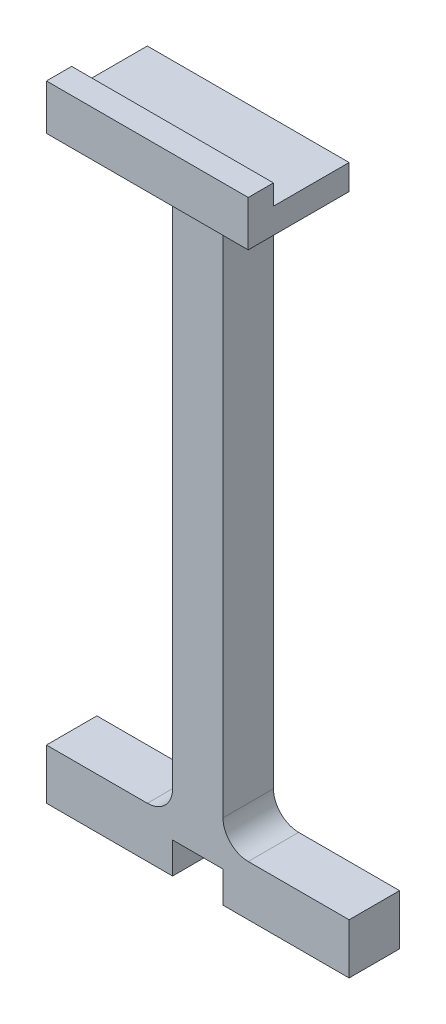
ISO-10303-21;
HEADER;
FILE_DESCRIPTION(('STEP AP214'),'2;1');
FILE_NAME('part.step','',(''),(''),'','','');
FILE_SCHEMA(('AUTOMOTIVE_DESIGN { 1 0 10303 214 1 1 1 1 }'));
ENDSEC;
DATA;
#1=APPLICATION_CONTEXT('core data for automotive mechanical design processes');
#2=APPLICATION_PROTOCOL_DEFINITION('international standard','automotive_design',2000,#1);
#3=PRODUCT_CONTEXT('',#1,'mechanical');
#4=PRODUCT('Part','Part','',(#3));
#5=PRODUCT_RELATED_PRODUCT_CATEGORY('part','',(#4));
#6=PRODUCT_DEFINITION_FORMATION('','',#4);
#7=PRODUCT_DEFINITION_CONTEXT('part definition',#1,'design');
#8=PRODUCT_DEFINITION('design','',#6,#7);
#9=PRODUCT_DEFINITION_SHAPE('','',#8);
#10=(LENGTH_UNIT() NAMED_UNIT(*) SI_UNIT(.MILLI.,.METRE.));
#11=(NAMED_UNIT(*) PLANE_ANGLE_UNIT() SI_UNIT($,.RADIAN.));
#12=(NAMED_UNIT(*) SI_UNIT($,.STERADIAN.) SOLID_ANGLE_UNIT());
#13=UNCERTAINTY_MEASURE_WITH_UNIT(LENGTH_MEASURE(1.E-05),#10,'distance_accuracy_value','');
#14=(GEOMETRIC_REPRESENTATION_CONTEXT(3) GLOBAL_UNCERTAINTY_ASSIGNED_CONTEXT((#13)) GLOBAL_UNIT_ASSIGNED_CONTEXT((#10,
#11,#12)) REPRESENTATION_CONTEXT('',''));
#15=CARTESIAN_POINT('',(0.,0.,0.));
#16=DIRECTION('',(0.,0.,1.));
#17=DIRECTION('',(1.,0.,0.));
#18=AXIS2_PLACEMENT_3D('',#15,#16,#17);
#19=CARTESIAN_POINT('',(-30.,-67.5,5.));
#20=DIRECTION('',(0.,1.,0.));
#21=DIRECTION('',(0.,0.,1.));
#22=AXIS2_PLACEMENT_3D('',#19,#20,#21);
#23=PLANE('',#22);
#24=DIRECTION('',(1.,0.,0.));
#25=VECTOR('',#24,1.);
#26=CARTESIAN_POINT('',(-30.,-67.5,5.));
#27=LINE('',#26,#25);
#28=CARTESIAN_POINT('',(5.00000000000002,-67.5,5.));
#29=VERTEX_POINT('',#28);
#30=CARTESIAN_POINT('',(30.,-67.5,5.));
#31=VERTEX_POINT('',#30);
#32=EDGE_CURVE('E262',#29,#31,#27,.T.);
#33=ORIENTED_EDGE('',*,*,#32,.F.);
#34=DIRECTION('',(0.,0.,1.));
#35=VECTOR('',#34,1.);
#36=CARTESIAN_POINT('',(5.00000000000002,-67.5,-5.));
#37=LINE('',#36,#35);
#38=CARTESIAN_POINT('',(5.00000000000002,-67.5,-5.));
#39=VERTEX_POINT('',#38);
#40=EDGE_CURVE('E218',#39,#29,#37,.T.);
#41=ORIENTED_EDGE('',*,*,#40,.F.);
#42=DIRECTION('',(1.,0.,0.));
#43=VECTOR('',#42,1.);
#44=CARTESIAN_POINT('',(-30.,-67.5,-5.));
#45=LINE('',#44,#43);
#46=CARTESIAN_POINT('',(30.,-67.5,-5.));
#47=VERTEX_POINT('',#46);
#48=EDGE_CURVE('E205',#39,#47,#45,.T.);
#49=ORIENTED_EDGE('',*,*,#48,.T.);
#50=DIRECTION('',(0.,0.,-1.));
#51=VECTOR('',#50,1.);
#52=CARTESIAN_POINT('',(30.,-67.5,5.));
#53=LINE('',#52,#51);
#54=EDGE_CURVE('E302',#31,#47,#53,.T.);
#55=ORIENTED_EDGE('',*,*,#54,.F.);
#56=EDGE_LOOP('',(#33,#41,#49,#55));
#57=FACE_BOUND('',#56,.T.);
#58=ADVANCED_FACE('F33',(#57),#23,.F.);
#59=CARTESIAN_POINT('',(-20.,62.5,5.));
#60=DIRECTION('',(0.,-1.,0.));
#61=DIRECTION('',(0.,0.,-1.));
#62=AXIS2_PLACEMENT_3D('',#59,#60,#61);
#63=PLANE('',#62);
#64=DIRECTION('',(-1.,0.,0.));
#65=VECTOR('',#64,1.);
#66=CARTESIAN_POINT('',(-20.,62.5,10.));
#67=LINE('',#66,#65);
#68=CARTESIAN_POINT('',(20.,62.5,10.));
#69=VERTEX_POINT('',#68);
#70=CARTESIAN_POINT('',(-20.,62.5,10.));
#71=VERTEX_POINT('',#70);
#72=EDGE_CURVE('E220',#69,#71,#67,.T.);
#73=ORIENTED_EDGE('',*,*,#72,.F.);
#74=DIRECTION('',(0.,0.,-1.));
#75=VECTOR('',#74,1.);
#76=CARTESIAN_POINT('',(20.,62.5,5.));
#77=LINE('',#76,#75);
#78=CARTESIAN_POINT('',(20.,62.5,-5.));
#79=VERTEX_POINT('',#78);
#80=EDGE_CURVE('E316',#69,#79,#77,.T.);
#81=ORIENTED_EDGE('',*,*,#80,.T.);
#82=DIRECTION('',(-1.,0.,0.));
#83=VECTOR('',#82,1.);
#84=CARTESIAN_POINT('',(-20.,62.5,-5.));
#85=LINE('',#84,#83);
#86=CARTESIAN_POINT('',(-20.,62.5,-5.));
#87=VERTEX_POINT('',#86);
#88=EDGE_CURVE('E279',#79,#87,#85,.T.);
#89=ORIENTED_EDGE('',*,*,#88,.T.);
#90=DIRECTION('',(0.,0.,-1.));
#91=VECTOR('',#90,1.);
#92=CARTESIAN_POINT('',(-20.,62.5,5.));
#93=LINE('',#92,#91);
#94=EDGE_CURVE('E314',#71,#87,#93,.T.);
#95=ORIENTED_EDGE('',*,*,#94,.F.);
#96=EDGE_LOOP('',(#73,#81,#89,#95));
#97=FACE_BOUND('',#96,.T.);
#98=ADVANCED_FACE('F381',(#97),#63,.F.);
#99=CARTESIAN_POINT('',(0.,0.,5.));
#100=DIRECTION('',(0.,0.,1.));
#101=DIRECTION('',(1.,0.,0.));
#102=AXIS2_PLACEMENT_3D('',#99,#100,#101);
#103=PLANE('',#102);
#104=DIRECTION('',(0.,1.,0.));
#105=VECTOR('',#104,1.);
#106=CARTESIAN_POINT('',(5.00000000000002,57.5,5.));
#107=LINE('',#106,#105);
#108=CARTESIAN_POINT('',(5.00000000000002,-52.5,5.));
#109=VERTEX_POINT('',#108);
#110=CARTESIAN_POINT('',(5.00000000000002,52.5,5.));
#111=VERTEX_POINT('',#110);
#112=EDGE_CURVE('E251',#109,#111,#107,.T.);
#113=ORIENTED_EDGE('',*,*,#112,.T.);
#114=DIRECTION('',(-1.,0.,0.));
#115=VECTOR('',#114,1.);
#116=CARTESIAN_POINT('',(0.,52.5,5.));
#117=LINE('',#116,#115);
#118=CARTESIAN_POINT('',(-5.00000000000002,52.5,5.));
#119=VERTEX_POINT('',#118);
#120=EDGE_CURVE('E340',#111,#119,#117,.T.);
#121=ORIENTED_EDGE('',*,*,#120,.T.);
#122=DIRECTION('',(0.,-1.,0.));
#123=VECTOR('',#122,1.);
#124=CARTESIAN_POINT('',(-5.00000000000002,57.5,5.));
#125=LINE('',#124,#123);
#126=CARTESIAN_POINT('',(-5.00000000000002,-52.5,5.));
#127=VERTEX_POINT('',#126);
#128=EDGE_CURVE('E254',#119,#127,#125,.T.);
#129=ORIENTED_EDGE('',*,*,#128,.T.);
#130=CARTESIAN_POINT('',(-10.,-52.5,5.));
#131=DIRECTION('',(0.,0.,1.));
#132=DIRECTION('',(1.,0.,0.));
#133=AXIS2_PLACEMENT_3D('',#130,#131,#132);
#134=CIRCLE('',#133,5.);
#135=CARTESIAN_POINT('',(-10.,-57.5,5.));
#136=VERTEX_POINT('',#135);
#137=EDGE_CURVE('E348',#127,#136,#134,.F.);
#138=ORIENTED_EDGE('',*,*,#137,.T.);
#139=DIRECTION('',(-1.,0.,0.));
#140=VECTOR('',#139,1.);
#141=CARTESIAN_POINT('',(-30.,-57.5,5.));
#142=LINE('',#141,#140);
#143=CARTESIAN_POINT('',(-30.,-57.5,5.));
#144=VERTEX_POINT('',#143);
#145=EDGE_CURVE('E258',#136,#144,#142,.T.);
#146=ORIENTED_EDGE('',*,*,#145,.T.);
#147=DIRECTION('',(0.,-1.,0.));
#148=VECTOR('',#147,1.);
#149=CARTESIAN_POINT('',(-30.,-67.5,5.));
#150=LINE('',#149,#148);
#151=CARTESIAN_POINT('',(-30.,-67.5,5.));
#152=VERTEX_POINT('',#151);
#153=EDGE_CURVE('E260',#144,#152,#150,.T.);
#154=ORIENTED_EDGE('',*,*,#153,.T.);
#155=CARTESIAN_POINT('',(-5.00000000000002,-67.5,5.));
#156=VERTEX_POINT('',#155);
#157=EDGE_CURVE('E263',#152,#156,#27,.T.);
#158=ORIENTED_EDGE('',*,*,#157,.T.);
#159=DIRECTION('',(0.,-1.,0.));
#160=VECTOR('',#159,1.);
#161=CARTESIAN_POINT('',(-5.00000000000002,-67.5,5.));
#162=LINE('',#161,#160);
#163=CARTESIAN_POINT('',(-5.00000000000002,-61.3,5.));
#164=VERTEX_POINT('',#163);
#165=EDGE_CURVE('E206',#164,#156,#162,.T.);
#166=ORIENTED_EDGE('',*,*,#165,.F.);
#167=DIRECTION('',(-1.,0.,0.));
#168=VECTOR('',#167,1.);
#169=CARTESIAN_POINT('',(5.00000000000002,-61.3,5.));
#170=LINE('',#169,#168);
#171=CARTESIAN_POINT('',(5.00000000000002,-61.3,5.));
#172=VERTEX_POINT('',#171);
#173=EDGE_CURVE('E208',#172,#164,#170,.T.);
#174=ORIENTED_EDGE('',*,*,#173,.F.);
#175=DIRECTION('',(0.,1.,0.));
#176=VECTOR('',#175,1.);
#177=CARTESIAN_POINT('',(5.00000000000002,-67.5,5.));
#178=LINE('',#177,#176);
#179=EDGE_CURVE('E188',#29,#172,#178,.T.);
#180=ORIENTED_EDGE('',*,*,#179,.F.);
#181=ORIENTED_EDGE('',*,*,#32,.T.);
#182=DIRECTION('',(0.,1.,0.));
#183=VECTOR('',#182,1.);
#184=CARTESIAN_POINT('',(30.,-67.5,5.));
#185=LINE('',#184,#183);
#186=CARTESIAN_POINT('',(30.,-57.5,5.));
#187=VERTEX_POINT('',#186);
#188=EDGE_CURVE('E266',#31,#187,#185,.T.);
#189=ORIENTED_EDGE('',*,*,#188,.T.);
#190=DIRECTION('',(-1.,0.,0.));
#191=VECTOR('',#190,1.);
#192=CARTESIAN_POINT('',(5.00000000000002,-57.5,5.));
#193=LINE('',#192,#191);
#194=CARTESIAN_POINT('',(10.,-57.5,5.));
#195=VERTEX_POINT('',#194);
#196=EDGE_CURVE('E268',#187,#195,#193,.T.);
#197=ORIENTED_EDGE('',*,*,#196,.T.);
#198=CARTESIAN_POINT('',(10.,-52.5,5.));
#199=DIRECTION('',(0.,0.,1.));
#200=DIRECTION('',(1.,0.,0.));
#201=AXIS2_PLACEMENT_3D('',#198,#199,#200);
#202=CIRCLE('',#201,5.);
#203=EDGE_CURVE('E344',#195,#109,#202,.F.);
#204=ORIENTED_EDGE('',*,*,#203,.T.);
#205=EDGE_LOOP('',(#113,#121,#129,#138,#146,#154,#158,#166,#174,#180,#181,#189,#197,#204));
#206=FACE_BOUND('',#205,.T.);
#207=ADVANCED_FACE('F388',(#206),#103,.T.);
#208=CARTESIAN_POINT('',(5.00000000000002,57.5,5.));
#209=DIRECTION('',(-1.,0.,0.));
#210=DIRECTION('',(0.,0.,1.));
#211=AXIS2_PLACEMENT_3D('',#208,#209,#210);
#212=PLANE('',#211);
#213=ORIENTED_EDGE('',*,*,#112,.F.);
#214=DIRECTION('',(0.,0.,-1.));
#215=VECTOR('',#214,1.);
#216=CARTESIAN_POINT('',(5.00000000000002,-52.5,-5.));
#217=LINE('',#216,#215);
#218=CARTESIAN_POINT('',(5.00000000000002,-52.5,-5.));
#219=VERTEX_POINT('',#218);
#220=EDGE_CURVE('E323',#109,#219,#217,.T.);
#221=ORIENTED_EDGE('',*,*,#220,.T.);
#222=DIRECTION('',(0.,1.,0.));
#223=VECTOR('',#222,1.);
#224=CARTESIAN_POINT('',(5.00000000000002,57.5,-5.));
#225=LINE('',#224,#223);
#226=CARTESIAN_POINT('',(5.00000000000002,52.5,-5.));
#227=VERTEX_POINT('',#226);
#228=EDGE_CURVE('E249',#219,#227,#225,.T.);
#229=ORIENTED_EDGE('',*,*,#228,.T.);
#230=DIRECTION('',(0.,0.,-1.));
#231=VECTOR('',#230,1.);
#232=CARTESIAN_POINT('',(5.00000000000002,52.5,5.));
#233=LINE('',#232,#231);
#234=EDGE_CURVE('E321',#227,#111,#233,.F.);
#235=ORIENTED_EDGE('',*,*,#234,.T.);
#236=EDGE_LOOP('',(#213,#221,#229,#235));
#237=FACE_BOUND('',#236,.T.);
#238=ADVANCED_FACE('F461',(#237),#212,.F.);
#239=CARTESIAN_POINT('',(20.,57.5,5.));
#240=DIRECTION('',(-1.,0.,0.));
#241=DIRECTION('',(0.,0.,1.));
#242=AXIS2_PLACEMENT_3D('',#239,#240,#241);
#243=PLANE('',#242);
#244=DIRECTION('',(0.,1.,0.));
#245=VECTOR('',#244,1.);
#246=CARTESIAN_POINT('',(20.,57.5,-5.));
#247=LINE('',#246,#245);
#248=CARTESIAN_POINT('',(20.,57.5,-5.));
#249=VERTEX_POINT('',#248);
#250=EDGE_CURVE('E276',#249,#79,#247,.T.);
#251=ORIENTED_EDGE('',*,*,#250,.T.);
#252=ORIENTED_EDGE('',*,*,#80,.F.);
#253=DIRECTION('',(0.,-1.,0.));
#254=VECTOR('',#253,1.);
#255=CARTESIAN_POINT('',(20.,66.5,10.));
#256=LINE('',#255,#254);
#257=CARTESIAN_POINT('',(20.,66.5,10.));
#258=VERTEX_POINT('',#257);
#259=EDGE_CURVE('E240',#258,#69,#256,.T.);
#260=ORIENTED_EDGE('',*,*,#259,.F.);
#261=DIRECTION('',(0.,0.,-1.));
#262=VECTOR('',#261,1.);
#263=CARTESIAN_POINT('',(20.,66.5,15.));
#264=LINE('',#263,#262);
#265=CARTESIAN_POINT('',(20.,66.5,15.));
#266=VERTEX_POINT('',#265);
#267=EDGE_CURVE('E231',#266,#258,#264,.T.);
#268=ORIENTED_EDGE('',*,*,#267,.F.);
#269=DIRECTION('',(0.,1.,0.));
#270=VECTOR('',#269,1.);
#271=CARTESIAN_POINT('',(20.,57.5,15.));
#272=LINE('',#271,#270);
#273=CARTESIAN_POINT('',(20.,57.5,15.));
#274=VERTEX_POINT('',#273);
#275=EDGE_CURVE('E247',#274,#266,#272,.T.);
#276=ORIENTED_EDGE('',*,*,#275,.F.);
#277=DIRECTION('',(0.,0.,-1.));
#278=VECTOR('',#277,1.);
#279=CARTESIAN_POINT('',(20.,57.5,5.));
#280=LINE('',#279,#278);
#281=EDGE_CURVE('E318',#274,#249,#280,.T.);
#282=ORIENTED_EDGE('',*,*,#281,.T.);
#283=EDGE_LOOP('',(#251,#252,#260,#268,#276,#282));
#284=FACE_BOUND('',#283,.T.);
#285=ADVANCED_FACE('F451',(#284),#243,.F.);
#286=CARTESIAN_POINT('',(-20.,57.5,5.));
#287=DIRECTION('',(1.,0.,0.));
#288=DIRECTION('',(0.,1.,0.));
#289=AXIS2_PLACEMENT_3D('',#286,#287,#288);
#290=PLANE('',#289);
#291=DIRECTION('',(0.,-1.,0.));
#292=VECTOR('',#291,1.);
#293=CARTESIAN_POINT('',(-20.,57.5,-5.));
#294=LINE('',#293,#292);
#295=CARTESIAN_POINT('',(-20.,57.5,-5.));
#296=VERTEX_POINT('',#295);
#297=EDGE_CURVE('E282',#87,#296,#294,.T.);
#298=ORIENTED_EDGE('',*,*,#297,.T.);
#299=DIRECTION('',(0.,0.,-1.));
#300=VECTOR('',#299,1.);
#301=CARTESIAN_POINT('',(-20.,57.5,5.));
#302=LINE('',#301,#300);
#303=CARTESIAN_POINT('',(-20.,57.5,15.));
#304=VERTEX_POINT('',#303);
#305=EDGE_CURVE('E311',#304,#296,#302,.T.);
#306=ORIENTED_EDGE('',*,*,#305,.F.);
#307=DIRECTION('',(0.,1.,0.));
#308=VECTOR('',#307,1.);
#309=CARTESIAN_POINT('',(-20.,57.5,15.));
#310=LINE('',#309,#308);
#311=CARTESIAN_POINT('',(-20.,66.5,15.));
#312=VERTEX_POINT('',#311);
#313=EDGE_CURVE('E246',#304,#312,#310,.T.);
#314=ORIENTED_EDGE('',*,*,#313,.T.);
#315=DIRECTION('',(0.,0.,1.));
#316=VECTOR('',#315,1.);
#317=CARTESIAN_POINT('',(-20.,66.5,15.));
#318=LINE('',#317,#316);
#319=CARTESIAN_POINT('',(-20.,66.5,10.));
#320=VERTEX_POINT('',#319);
#321=EDGE_CURVE('E225',#320,#312,#318,.T.);
#322=ORIENTED_EDGE('',*,*,#321,.F.);
#323=DIRECTION('',(0.,-1.,0.));
#324=VECTOR('',#323,1.);
#325=CARTESIAN_POINT('',(-20.,66.5,10.));
#326=LINE('',#325,#324);
#327=EDGE_CURVE('E235',#320,#71,#326,.T.);
#328=ORIENTED_EDGE('',*,*,#327,.T.);
#329=ORIENTED_EDGE('',*,*,#94,.T.);
#330=EDGE_LOOP('',(#298,#306,#314,#322,#328,#329));
#331=FACE_BOUND('',#330,.T.);
#332=ADVANCED_FACE('F435',(#331),#290,.F.);
#333=CARTESIAN_POINT('',(-20.,57.5,5.));
#334=DIRECTION('',(0.,1.,0.));
#335=DIRECTION('',(0.,0.,1.));
#336=AXIS2_PLACEMENT_3D('',#333,#334,#335);
#337=PLANE('',#336);
#338=DIRECTION('',(1.,0.,0.));
#339=VECTOR('',#338,1.);
#340=CARTESIAN_POINT('',(-20.,57.5,-5.));
#341=LINE('',#340,#339);
#342=CARTESIAN_POINT('',(-10.,57.5,-5.));
#343=VERTEX_POINT('',#342);
#344=EDGE_CURVE('E284',#296,#343,#341,.T.);
#345=ORIENTED_EDGE('',*,*,#344,.T.);
#346=DIRECTION('',(0.,0.,-1.));
#347=VECTOR('',#346,1.);
#348=CARTESIAN_POINT('',(-10.,57.5,5.));
#349=LINE('',#348,#347);
#350=CARTESIAN_POINT('',(-10.,57.5,10.));
#351=VERTEX_POINT('',#350);
#352=EDGE_CURVE('E50',#343,#351,#349,.F.);
#353=ORIENTED_EDGE('',*,*,#352,.T.);
#354=DIRECTION('',(-1.,0.,0.));
#355=VECTOR('',#354,1.);
#356=CARTESIAN_POINT('',(-20.,57.5,10.));
#357=LINE('',#356,#355);
#358=CARTESIAN_POINT('',(10.,57.5,10.));
#359=VERTEX_POINT('',#358);
#360=EDGE_CURVE('E54',#351,#359,#357,.F.);
#361=ORIENTED_EDGE('',*,*,#360,.T.);
#362=DIRECTION('',(0.,0.,-1.));
#363=VECTOR('',#362,1.);
#364=CARTESIAN_POINT('',(10.,57.5,-5.));
#365=LINE('',#364,#363);
#366=CARTESIAN_POINT('',(10.,57.5,-5.));
#367=VERTEX_POINT('',#366);
#368=EDGE_CURVE('E336',#359,#367,#365,.T.);
#369=ORIENTED_EDGE('',*,*,#368,.T.);
#370=DIRECTION('',(1.,0.,0.));
#371=VECTOR('',#370,1.);
#372=CARTESIAN_POINT('',(5.00000000000002,57.5,-5.));
#373=LINE('',#372,#371);
#374=EDGE_CURVE('E274',#367,#249,#373,.T.);
#375=ORIENTED_EDGE('',*,*,#374,.T.);
#376=ORIENTED_EDGE('',*,*,#281,.F.);
#377=DIRECTION('',(1.,0.,0.));
#378=VECTOR('',#377,1.);
#379=CARTESIAN_POINT('',(-20.,57.5,15.));
#380=LINE('',#379,#378);
#381=EDGE_CURVE('E243',#304,#274,#380,.T.);
#382=ORIENTED_EDGE('',*,*,#381,.F.);
#383=ORIENTED_EDGE('',*,*,#305,.T.);
#384=EDGE_LOOP('',(#345,#353,#361,#369,#375,#376,#382,#383));
#385=FACE_BOUND('',#384,.T.);
#386=ADVANCED_FACE('F431',(#385),#337,.F.);
#387=CARTESIAN_POINT('',(-5.00000000000002,57.5,5.));
#388=DIRECTION('',(1.,0.,0.));
#389=DIRECTION('',(0.,0.,-1.));
#390=AXIS2_PLACEMENT_3D('',#387,#388,#389);
#391=PLANE('',#390);
#392=DIRECTION('',(0.,-1.,0.));
#393=VECTOR('',#392,1.);
#394=CARTESIAN_POINT('',(-5.00000000000002,57.5,-5.));
#395=LINE('',#394,#393);
#396=CARTESIAN_POINT('',(-5.00000000000002,52.5,-5.));
#397=VERTEX_POINT('',#396);
#398=CARTESIAN_POINT('',(-5.00000000000002,-52.5,-5.));
#399=VERTEX_POINT('',#398);
#400=EDGE_CURVE('E286',#397,#399,#395,.T.);
#401=ORIENTED_EDGE('',*,*,#400,.T.);
#402=DIRECTION('',(0.,0.,-1.));
#403=VECTOR('',#402,1.);
#404=CARTESIAN_POINT('',(-5.00000000000002,-52.5,5.));
#405=LINE('',#404,#403);
#406=EDGE_CURVE('E334',#399,#127,#405,.F.);
#407=ORIENTED_EDGE('',*,*,#406,.T.);
#408=ORIENTED_EDGE('',*,*,#128,.F.);
#409=DIRECTION('',(0.,0.,-1.));
#410=VECTOR('',#409,1.);
#411=CARTESIAN_POINT('',(-5.00000000000002,52.5,-5.));
#412=LINE('',#411,#410);
#413=EDGE_CURVE('E331',#119,#397,#412,.T.);
#414=ORIENTED_EDGE('',*,*,#413,.T.);
#415=EDGE_LOOP('',(#401,#407,#408,#414));
#416=FACE_BOUND('',#415,.T.);
#417=ADVANCED_FACE('F423',(#416),#391,.F.);
#418=CARTESIAN_POINT('',(-30.,-57.5,5.));
#419=DIRECTION('',(0.,-1.,0.));
#420=DIRECTION('',(0.,0.,-1.));
#421=AXIS2_PLACEMENT_3D('',#418,#419,#420);
#422=PLANE('',#421);
#423=ORIENTED_EDGE('',*,*,#145,.F.);
#424=DIRECTION('',(0.,0.,-1.));
#425=VECTOR('',#424,1.);
#426=CARTESIAN_POINT('',(-10.,-57.5,-5.));
#427=LINE('',#426,#425);
#428=CARTESIAN_POINT('',(-10.,-57.5,-5.));
#429=VERTEX_POINT('',#428);
#430=EDGE_CURVE('E328',#136,#429,#427,.T.);
#431=ORIENTED_EDGE('',*,*,#430,.T.);
#432=DIRECTION('',(-1.,0.,0.));
#433=VECTOR('',#432,1.);
#434=CARTESIAN_POINT('',(-30.,-57.5,-5.));
#435=LINE('',#434,#433);
#436=CARTESIAN_POINT('',(-30.,-57.5,-5.));
#437=VERTEX_POINT('',#436);
#438=EDGE_CURVE('E289',#429,#437,#435,.T.);
#439=ORIENTED_EDGE('',*,*,#438,.T.);
#440=DIRECTION('',(0.,0.,-1.));
#441=VECTOR('',#440,1.);
#442=CARTESIAN_POINT('',(-30.,-57.5,5.));
#443=LINE('',#442,#441);
#444=EDGE_CURVE('E308',#144,#437,#443,.T.);
#445=ORIENTED_EDGE('',*,*,#444,.F.);
#446=EDGE_LOOP('',(#423,#431,#439,#445));
#447=FACE_BOUND('',#446,.T.);
#448=ADVANCED_FACE('F404',(#447),#422,.F.);
#449=CARTESIAN_POINT('',(-30.,-67.5,5.));
#450=DIRECTION('',(1.,0.,0.));
#451=DIRECTION('',(0.,0.,-1.));
#452=AXIS2_PLACEMENT_3D('',#449,#450,#451);
#453=PLANE('',#452);
#454=DIRECTION('',(0.,-1.,0.));
#455=VECTOR('',#454,1.);
#456=CARTESIAN_POINT('',(-30.,-67.5,-5.));
#457=LINE('',#456,#455);
#458=CARTESIAN_POINT('',(-30.,-67.5,-5.));
#459=VERTEX_POINT('',#458);
#460=EDGE_CURVE('E291',#437,#459,#457,.T.);
#461=ORIENTED_EDGE('',*,*,#460,.T.);
#462=DIRECTION('',(0.,0.,-1.));
#463=VECTOR('',#462,1.);
#464=CARTESIAN_POINT('',(-30.,-67.5,5.));
#465=LINE('',#464,#463);
#466=EDGE_CURVE('E305',#152,#459,#465,.T.);
#467=ORIENTED_EDGE('',*,*,#466,.F.);
#468=ORIENTED_EDGE('',*,*,#153,.F.);
#469=ORIENTED_EDGE('',*,*,#444,.T.);
#470=EDGE_LOOP('',(#461,#467,#468,#469));
#471=FACE_BOUND('',#470,.T.);
#472=ADVANCED_FACE('F396',(#471),#453,.F.);
#473=CARTESIAN_POINT('',(-5.00000000000002,-67.5,-5.));
#474=VERTEX_POINT('',#473);
#475=EDGE_CURVE('E293',#459,#474,#45,.T.);
#476=ORIENTED_EDGE('',*,*,#475,.T.);
#477=DIRECTION('',(0.,0.,1.));
#478=VECTOR('',#477,1.);
#479=CARTESIAN_POINT('',(-5.00000000000002,-67.5,-5.));
#480=LINE('',#479,#478);
#481=EDGE_CURVE('E221',#474,#156,#480,.T.);
#482=ORIENTED_EDGE('',*,*,#481,.T.);
#483=ORIENTED_EDGE('',*,*,#157,.F.);
#484=ORIENTED_EDGE('',*,*,#466,.T.);
#485=EDGE_LOOP('',(#476,#482,#483,#484));
#486=FACE_BOUND('',#485,.T.);
#487=ADVANCED_FACE('F384',(#486),#23,.F.);
#488=CARTESIAN_POINT('',(30.,-67.5,5.));
#489=DIRECTION('',(-1.,0.,0.));
#490=DIRECTION('',(0.,0.,1.));
#491=AXIS2_PLACEMENT_3D('',#488,#489,#490);
#492=PLANE('',#491);
#493=DIRECTION('',(0.,1.,0.));
#494=VECTOR('',#493,1.);
#495=CARTESIAN_POINT('',(30.,-67.5,-5.));
#496=LINE('',#495,#494);
#497=CARTESIAN_POINT('',(30.,-57.5,-5.));
#498=VERTEX_POINT('',#497);
#499=EDGE_CURVE('E296',#47,#498,#496,.T.);
#500=ORIENTED_EDGE('',*,*,#499,.T.);
#501=DIRECTION('',(0.,0.,-1.));
#502=VECTOR('',#501,1.);
#503=CARTESIAN_POINT('',(30.,-57.5,5.));
#504=LINE('',#503,#502);
#505=EDGE_CURVE('E271',#187,#498,#504,.T.);
#506=ORIENTED_EDGE('',*,*,#505,.F.);
#507=ORIENTED_EDGE('',*,*,#188,.F.);
#508=ORIENTED_EDGE('',*,*,#54,.T.);
#509=EDGE_LOOP('',(#500,#506,#507,#508));
#510=FACE_BOUND('',#509,.T.);
#511=ADVANCED_FACE('F395',(#510),#492,.F.);
#512=CARTESIAN_POINT('',(5.00000000000002,-57.5,5.));
#513=DIRECTION('',(0.,-1.,0.));
#514=DIRECTION('',(0.,0.,-1.));
#515=AXIS2_PLACEMENT_3D('',#512,#513,#514);
#516=PLANE('',#515);
#517=DIRECTION('',(-1.,0.,0.));
#518=VECTOR('',#517,1.);
#519=CARTESIAN_POINT('',(5.00000000000002,-57.5,-5.));
#520=LINE('',#519,#518);
#521=CARTESIAN_POINT('',(10.,-57.5,-5.));
#522=VERTEX_POINT('',#521);
#523=EDGE_CURVE('E255',#498,#522,#520,.T.);
#524=ORIENTED_EDGE('',*,*,#523,.T.);
#525=DIRECTION('',(0.,0.,-1.));
#526=VECTOR('',#525,1.);
#527=CARTESIAN_POINT('',(10.,-57.5,5.));
#528=LINE('',#527,#526);
#529=EDGE_CURVE('E326',#522,#195,#528,.F.);
#530=ORIENTED_EDGE('',*,*,#529,.T.);
#531=ORIENTED_EDGE('',*,*,#196,.F.);
#532=ORIENTED_EDGE('',*,*,#505,.T.);
#533=EDGE_LOOP('',(#524,#530,#531,#532));
#534=FACE_BOUND('',#533,.T.);
#535=ADVANCED_FACE('F402',(#534),#516,.F.);
#536=CARTESIAN_POINT('',(0.,0.,-5.));
#537=DIRECTION('',(0.,0.,1.));
#538=DIRECTION('',(1.,0.,0.));
#539=AXIS2_PLACEMENT_3D('',#536,#537,#538);
#540=PLANE('',#539);
#541=ORIENTED_EDGE('',*,*,#48,.F.);
#542=DIRECTION('',(0.,1.,0.));
#543=VECTOR('',#542,1.);
#544=CARTESIAN_POINT('',(5.00000000000002,-67.5,-5.));
#545=LINE('',#544,#543);
#546=CARTESIAN_POINT('',(5.00000000000002,-61.3,-5.));
#547=VERTEX_POINT('',#546);
#548=EDGE_CURVE('E185',#39,#547,#545,.T.);
#549=ORIENTED_EDGE('',*,*,#548,.T.);
#550=DIRECTION('',(-1.,0.,0.));
#551=VECTOR('',#550,1.);
#552=CARTESIAN_POINT('',(5.00000000000002,-61.3,-5.));
#553=LINE('',#552,#551);
#554=CARTESIAN_POINT('',(-5.00000000000002,-61.3,-5.));
#555=VERTEX_POINT('',#554);
#556=EDGE_CURVE('E197',#547,#555,#553,.T.);
#557=ORIENTED_EDGE('',*,*,#556,.T.);
#558=DIRECTION('',(0.,-1.,0.));
#559=VECTOR('',#558,1.);
#560=CARTESIAN_POINT('',(-5.00000000000002,-67.5,-5.));
#561=LINE('',#560,#559);
#562=EDGE_CURVE('E193',#555,#474,#561,.T.);
#563=ORIENTED_EDGE('',*,*,#562,.T.);
#564=ORIENTED_EDGE('',*,*,#475,.F.);
#565=ORIENTED_EDGE('',*,*,#460,.F.);
#566=ORIENTED_EDGE('',*,*,#438,.F.);
#567=CARTESIAN_POINT('',(-10.,-52.5,-5.));
#568=DIRECTION('',(0.,0.,1.));
#569=DIRECTION('',(1.,0.,0.));
#570=AXIS2_PLACEMENT_3D('',#567,#568,#569);
#571=CIRCLE('',#570,5.);
#572=EDGE_CURVE('E346',#429,#399,#571,.T.);
#573=ORIENTED_EDGE('',*,*,#572,.T.);
#574=ORIENTED_EDGE('',*,*,#400,.F.);
#575=CARTESIAN_POINT('',(-10.,52.5,-5.));
#576=DIRECTION('',(0.,0.,1.));
#577=DIRECTION('',(1.,0.,0.));
#578=AXIS2_PLACEMENT_3D('',#575,#576,#577);
#579=CIRCLE('',#578,5.);
#580=EDGE_CURVE('E42',#397,#343,#579,.T.);
#581=ORIENTED_EDGE('',*,*,#580,.T.);
#582=ORIENTED_EDGE('',*,*,#344,.F.);
#583=ORIENTED_EDGE('',*,*,#297,.F.);
#584=ORIENTED_EDGE('',*,*,#88,.F.);
#585=ORIENTED_EDGE('',*,*,#250,.F.);
#586=ORIENTED_EDGE('',*,*,#374,.F.);
#587=CARTESIAN_POINT('',(10.,52.5,-5.));
#588=DIRECTION('',(0.,0.,1.));
#589=DIRECTION('',(1.,0.,0.));
#590=AXIS2_PLACEMENT_3D('',#587,#588,#589);
#591=CIRCLE('',#590,5.);
#592=EDGE_CURVE('E11',#367,#227,#591,.T.);
#593=ORIENTED_EDGE('',*,*,#592,.T.);
#594=ORIENTED_EDGE('',*,*,#228,.F.);
#595=CARTESIAN_POINT('',(10.,-52.5,-5.));
#596=DIRECTION('',(0.,0.,1.));
#597=DIRECTION('',(1.,0.,0.));
#598=AXIS2_PLACEMENT_3D('',#595,#596,#597);
#599=CIRCLE('',#598,5.);
#600=EDGE_CURVE('E342',#219,#522,#599,.T.);
#601=ORIENTED_EDGE('',*,*,#600,.T.);
#602=ORIENTED_EDGE('',*,*,#523,.F.);
#603=ORIENTED_EDGE('',*,*,#499,.F.);
#604=EDGE_LOOP('',(#541,#549,#557,#563,#564,#565,#566,#573,#574,#581,#582,#583,#584,#585,#586,
#593,#594,#601,#602,#603));
#605=FACE_BOUND('',#604,.T.);
#606=ADVANCED_FACE('F203',(#605),#540,.F.);
#607=CARTESIAN_POINT('',(-20.,57.5,15.));
#608=DIRECTION('',(0.,0.,1.));
#609=DIRECTION('',(1.,0.,0.));
#610=AXIS2_PLACEMENT_3D('',#607,#608,#609);
#611=PLANE('',#610);
#612=ORIENTED_EDGE('',*,*,#275,.T.);
#613=DIRECTION('',(1.,0.,0.));
#614=VECTOR('',#613,1.);
#615=CARTESIAN_POINT('',(-20.,66.5,15.));
#616=LINE('',#615,#614);
#617=EDGE_CURVE('E228',#312,#266,#616,.T.);
#618=ORIENTED_EDGE('',*,*,#617,.F.);
#619=ORIENTED_EDGE('',*,*,#313,.F.);
#620=ORIENTED_EDGE('',*,*,#381,.T.);
#621=EDGE_LOOP('',(#612,#618,#619,#620));
#622=FACE_BOUND('',#621,.T.);
#623=ADVANCED_FACE('F439',(#622),#611,.T.);
#624=CARTESIAN_POINT('',(-20.,66.5,10.));
#625=DIRECTION('',(0.,0.,1.));
#626=DIRECTION('',(1.,0.,0.));
#627=AXIS2_PLACEMENT_3D('',#624,#625,#626);
#628=PLANE('',#627);
#629=ORIENTED_EDGE('',*,*,#72,.T.);
#630=ORIENTED_EDGE('',*,*,#327,.F.);
#631=DIRECTION('',(-1.,0.,0.));
#632=VECTOR('',#631,1.);
#633=CARTESIAN_POINT('',(-20.,66.5,10.));
#634=LINE('',#633,#632);
#635=EDGE_CURVE('E233',#258,#320,#634,.T.);
#636=ORIENTED_EDGE('',*,*,#635,.F.);
#637=ORIENTED_EDGE('',*,*,#259,.T.);
#638=EDGE_LOOP('',(#629,#630,#636,#637));
#639=FACE_BOUND('',#638,.T.);
#640=ADVANCED_FACE('F447',(#639),#628,.F.);
#641=CARTESIAN_POINT('',(0.,66.5,0.));
#642=DIRECTION('',(0.,-1.,0.));
#643=DIRECTION('',(0.,0.,-1.));
#644=AXIS2_PLACEMENT_3D('',#641,#642,#643);
#645=PLANE('',#644);
#646=ORIENTED_EDGE('',*,*,#321,.T.);
#647=ORIENTED_EDGE('',*,*,#617,.T.);
#648=ORIENTED_EDGE('',*,*,#267,.T.);
#649=ORIENTED_EDGE('',*,*,#635,.T.);
#650=EDGE_LOOP('',(#646,#647,#648,#649));
#651=FACE_BOUND('',#650,.T.);
#652=ADVANCED_FACE('F443',(#651),#645,.F.);
#653=CARTESIAN_POINT('',(5.00000000000002,-67.5,-5.));
#654=DIRECTION('',(1.,0.,0.));
#655=DIRECTION('',(0.,1.,0.));
#656=AXIS2_PLACEMENT_3D('',#653,#654,#655);
#657=PLANE('',#656);
#658=ORIENTED_EDGE('',*,*,#179,.T.);
#659=DIRECTION('',(0.,0.,1.));
#660=VECTOR('',#659,1.);
#661=CARTESIAN_POINT('',(5.00000000000002,-61.3,-5.));
#662=LINE('',#661,#660);
#663=EDGE_CURVE('E181',#547,#172,#662,.T.);
#664=ORIENTED_EDGE('',*,*,#663,.F.);
#665=ORIENTED_EDGE('',*,*,#548,.F.);
#666=ORIENTED_EDGE('',*,*,#40,.T.);
#667=EDGE_LOOP('',(#658,#664,#665,#666));
#668=FACE_BOUND('',#667,.T.);
#669=ADVANCED_FACE('F183',(#668),#657,.F.);
#670=CARTESIAN_POINT('',(-5.00000000000002,-67.5,-5.));
#671=DIRECTION('',(-1.,0.,0.));
#672=DIRECTION('',(0.,0.,1.));
#673=AXIS2_PLACEMENT_3D('',#670,#671,#672);
#674=PLANE('',#673);
#675=ORIENTED_EDGE('',*,*,#165,.T.);
#676=ORIENTED_EDGE('',*,*,#481,.F.);
#677=ORIENTED_EDGE('',*,*,#562,.F.);
#678=DIRECTION('',(0.,0.,1.));
#679=VECTOR('',#678,1.);
#680=CARTESIAN_POINT('',(-5.00000000000002,-61.3,-5.));
#681=LINE('',#680,#679);
#682=EDGE_CURVE('E192',#555,#164,#681,.T.);
#683=ORIENTED_EDGE('',*,*,#682,.T.);
#684=EDGE_LOOP('',(#675,#676,#677,#683));
#685=FACE_BOUND('',#684,.T.);
#686=ADVANCED_FACE('F376',(#685),#674,.F.);
#687=CARTESIAN_POINT('',(5.00000000000002,-61.3,-5.));
#688=DIRECTION('',(0.,1.,0.));
#689=DIRECTION('',(0.,0.,1.));
#690=AXIS2_PLACEMENT_3D('',#687,#688,#689);
#691=PLANE('',#690);
#692=CARTESIAN_POINT('',(0.,-61.3,0.));
#693=DIRECTION('',(0.,-1.,0.));
#694=DIRECTION('',(0.,0.,-1.));
#695=AXIS2_PLACEMENT_3D('',#692,#693,#694);
#696=CIRCLE('',#695,2.);
#697=CARTESIAN_POINT('',(0.,-61.3,-2.));
#698=VERTEX_POINT('',#697);
#699=EDGE_CURVE('E211',#698,#698,#696,.T.);
#700=ORIENTED_EDGE('',*,*,#699,.F.);
#701=EDGE_LOOP('',(#700));
#702=FACE_BOUND('',#701,.T.);
#703=ORIENTED_EDGE('',*,*,#173,.T.);
#704=ORIENTED_EDGE('',*,*,#682,.F.);
#705=ORIENTED_EDGE('',*,*,#556,.F.);
#706=ORIENTED_EDGE('',*,*,#663,.T.);
#707=EDGE_LOOP('',(#703,#704,#705,#706));
#708=FACE_BOUND('',#707,.T.);
#709=ADVANCED_FACE('F198',(#702,#708),#691,.F.);
#710=CARTESIAN_POINT('',(0.,-55.3,0.));
#711=DIRECTION('',(0.,-1.,0.));
#712=DIRECTION('',(0.,0.,-1.));
#713=AXIS2_PLACEMENT_3D('',#710,#711,#712);
#714=CYLINDRICAL_SURFACE('',#713,2.);
#715=CARTESIAN_POINT('',(0.,-55.3,0.));
#716=DIRECTION('',(0.,-1.,0.));
#717=DIRECTION('',(0.,0.,-1.));
#718=AXIS2_PLACEMENT_3D('',#715,#716,#717);
#719=CIRCLE('',#718,2.);
#720=CARTESIAN_POINT('',(0.,-55.3,-2.));
#721=VERTEX_POINT('',#720);
#722=EDGE_CURVE('E216',#721,#721,#719,.T.);
#723=ORIENTED_EDGE('',*,*,#722,.F.);
#724=EDGE_LOOP('',(#723));
#725=FACE_BOUND('',#724,.T.);
#726=ORIENTED_EDGE('',*,*,#699,.T.);
#727=EDGE_LOOP('',(#726));
#728=FACE_BOUND('',#727,.T.);
#729=ADVANCED_FACE('F367',(#725,#728),#714,.F.);
#730=CARTESIAN_POINT('',(0.,-55.3,0.));
#731=DIRECTION('',(0.,-1.,0.));
#732=DIRECTION('',(0.,0.,-1.));
#733=AXIS2_PLACEMENT_3D('',#730,#731,#732);
#734=PLANE('',#733);
#735=ORIENTED_EDGE('',*,*,#722,.T.);
#736=EDGE_LOOP('',(#735));
#737=FACE_BOUND('',#736,.T.);
#738=ADVANCED_FACE('F365',(#737),#734,.T.);
#739=CARTESIAN_POINT('',(10.,-52.5,5.));
#740=DIRECTION('',(0.,0.,1.));
#741=DIRECTION('',(1.,0.,0.));
#742=AXIS2_PLACEMENT_3D('',#739,#740,#741);
#743=CYLINDRICAL_SURFACE('',#742,5.);
#744=ORIENTED_EDGE('',*,*,#203,.F.);
#745=ORIENTED_EDGE('',*,*,#529,.F.);
#746=ORIENTED_EDGE('',*,*,#600,.F.);
#747=ORIENTED_EDGE('',*,*,#220,.F.);
#748=EDGE_LOOP('',(#744,#745,#746,#747));
#749=FACE_BOUND('',#748,.T.);
#750=ADVANCED_FACE('F374',(#749),#743,.F.);
#751=CARTESIAN_POINT('',(-10.,-52.5,5.));
#752=DIRECTION('',(0.,0.,1.));
#753=DIRECTION('',(1.,0.,0.));
#754=AXIS2_PLACEMENT_3D('',#751,#752,#753);
#755=CYLINDRICAL_SURFACE('',#754,5.);
#756=ORIENTED_EDGE('',*,*,#137,.F.);
#757=ORIENTED_EDGE('',*,*,#406,.F.);
#758=ORIENTED_EDGE('',*,*,#572,.F.);
#759=ORIENTED_EDGE('',*,*,#430,.F.);
#760=EDGE_LOOP('',(#756,#757,#758,#759));
#761=FACE_BOUND('',#760,.T.);
#762=ADVANCED_FACE('F426',(#761),#755,.F.);
#763=CARTESIAN_POINT('',(10.,52.5,5.));
#764=DIRECTION('',(0.,0.,1.));
#765=DIRECTION('',(1.,0.,0.));
#766=AXIS2_PLACEMENT_3D('',#763,#764,#765);
#767=CYLINDRICAL_SURFACE('',#766,5.);
#768=ORIENTED_EDGE('',*,*,#592,.F.);
#769=ORIENTED_EDGE('',*,*,#368,.F.);
#770=CARTESIAN_POINT('',(10.,52.5,10.));
#771=DIRECTION('',(-0.707106781186547,0.,0.707106781186547));
#772=DIRECTION('',(0.707106781186547,0.,0.707106781186547));
#773=AXIS2_PLACEMENT_3D('',#770,#771,#772);
#774=ELLIPSE('',#773,7.07106781186547,5.);
#775=EDGE_CURVE('E37',#111,#359,#774,.F.);
#776=ORIENTED_EDGE('',*,*,#775,.F.);
#777=ORIENTED_EDGE('',*,*,#234,.F.);
#778=EDGE_LOOP('',(#768,#769,#776,#777));
#779=FACE_BOUND('',#778,.T.);
#780=ADVANCED_FACE('F35',(#779),#767,.F.);
#781=CARTESIAN_POINT('',(0.,52.5,10.));
#782=DIRECTION('',(-1.,0.,0.));
#783=DIRECTION('',(0.,0.,1.));
#784=AXIS2_PLACEMENT_3D('',#781,#782,#783);
#785=CYLINDRICAL_SURFACE('',#784,5.);
#786=ORIENTED_EDGE('',*,*,#775,.T.);
#787=ORIENTED_EDGE('',*,*,#360,.F.);
#788=CARTESIAN_POINT('',(-10.,52.5,10.));
#789=DIRECTION('',(-0.707106781186547,0.,-0.707106781186547));
#790=DIRECTION('',(-0.707106781186547,0.,0.707106781186547));
#791=AXIS2_PLACEMENT_3D('',#788,#789,#790);
#792=ELLIPSE('',#791,7.07106781186547,5.);
#793=EDGE_CURVE('E350',#119,#351,#792,.F.);
#794=ORIENTED_EDGE('',*,*,#793,.F.);
#795=ORIENTED_EDGE('',*,*,#120,.F.);
#796=EDGE_LOOP('',(#786,#787,#794,#795));
#797=FACE_BOUND('',#796,.T.);
#798=ADVANCED_FACE('F427',(#797),#785,.F.);
#799=CARTESIAN_POINT('',(-10.,52.5,5.));
#800=DIRECTION('',(0.,0.,1.));
#801=DIRECTION('',(1.,0.,0.));
#802=AXIS2_PLACEMENT_3D('',#799,#800,#801);
#803=CYLINDRICAL_SURFACE('',#802,5.);
#804=ORIENTED_EDGE('',*,*,#793,.T.);
#805=ORIENTED_EDGE('',*,*,#352,.F.);
#806=ORIENTED_EDGE('',*,*,#580,.F.);
#807=ORIENTED_EDGE('',*,*,#413,.F.);
#808=EDGE_LOOP('',(#804,#805,#806,#807));
#809=FACE_BOUND('',#808,.T.);
#810=ADVANCED_FACE('F428',(#809),#803,.F.);
#811=CLOSED_SHELL('',(#58,#98,#207,#238,#285,#332,#386,#417,#448,#472,#487,#511,#535,#606,#623,
#640,#652,#669,#686,#709,#729,#738,#750,#762,#780,#798,#810));
#812=MANIFOLD_SOLID_BREP('B2',#811);
#813=ADVANCED_BREP_SHAPE_REPRESENTATION('',(#18,#812),#14);
#814=SHAPE_DEFINITION_REPRESENTATION(#9,#813);
ENDSEC;
END-ISO-10303-21;
